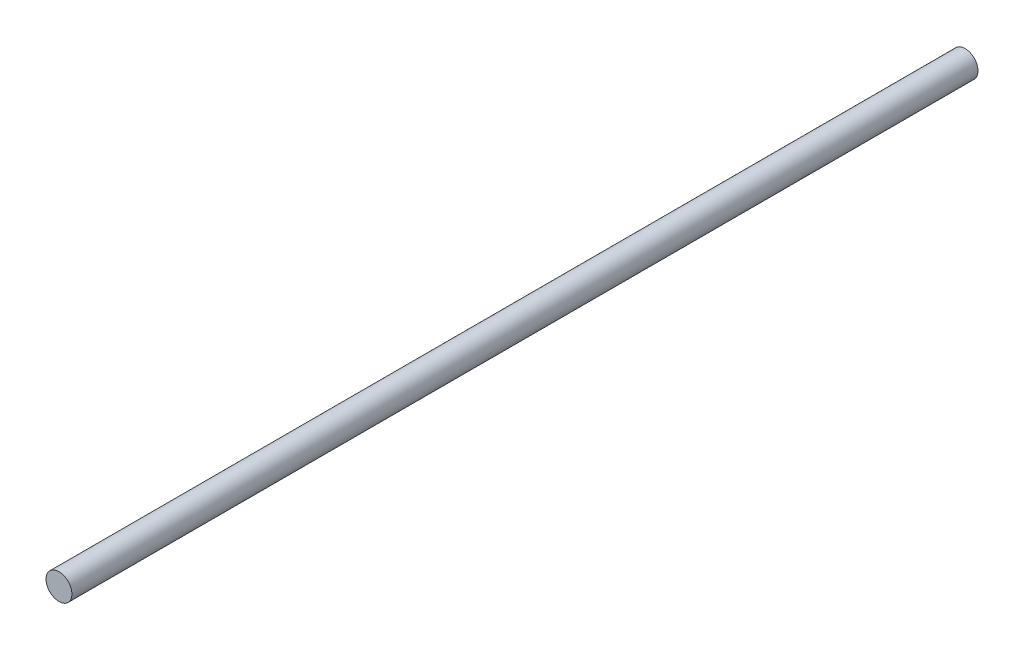
ISO-10303-21;
HEADER;
FILE_DESCRIPTION(('STEP AP214'),'2;1');
FILE_NAME('part.step','',(''),(''),'','','');
FILE_SCHEMA(('AUTOMOTIVE_DESIGN { 1 0 10303 214 1 1 1 1 }'));
ENDSEC;
DATA;
#1=APPLICATION_CONTEXT('core data for automotive mechanical design processes');
#2=APPLICATION_PROTOCOL_DEFINITION('international standard','automotive_design',2000,#1);
#3=PRODUCT_CONTEXT('',#1,'mechanical');
#4=PRODUCT('Part','Part','',(#3));
#5=PRODUCT_RELATED_PRODUCT_CATEGORY('part','',(#4));
#6=PRODUCT_DEFINITION_FORMATION('','',#4);
#7=PRODUCT_DEFINITION_CONTEXT('part definition',#1,'design');
#8=PRODUCT_DEFINITION('design','',#6,#7);
#9=PRODUCT_DEFINITION_SHAPE('','',#8);
#10=(LENGTH_UNIT() NAMED_UNIT(*) SI_UNIT(.MILLI.,.METRE.));
#11=(NAMED_UNIT(*) PLANE_ANGLE_UNIT() SI_UNIT($,.RADIAN.));
#12=(NAMED_UNIT(*) SI_UNIT($,.STERADIAN.) SOLID_ANGLE_UNIT());
#13=UNCERTAINTY_MEASURE_WITH_UNIT(LENGTH_MEASURE(1.E-05),#10,'distance_accuracy_value','');
#14=(GEOMETRIC_REPRESENTATION_CONTEXT(3) GLOBAL_UNCERTAINTY_ASSIGNED_CONTEXT((#13)) GLOBAL_UNIT_ASSIGNED_CONTEXT((#10,
#11,#12)) REPRESENTATION_CONTEXT('',''));
#15=CARTESIAN_POINT('',(0.,0.,0.));
#16=DIRECTION('',(0.,0.,1.));
#17=DIRECTION('',(1.,0.,0.));
#18=AXIS2_PLACEMENT_3D('',#15,#16,#17);
#19=CARTESIAN_POINT('',(-3.01379167716471,0.,-91.2439030318299));
#20=DIRECTION('',(0.,0.,-1.));
#21=DIRECTION('',(-1.,0.,0.));
#22=AXIS2_PLACEMENT_3D('',#19,#20,#21);
#23=CYLINDRICAL_SURFACE('',#22,2.54);
#24=CARTESIAN_POINT('',(-3.0137916771647,0.,86.55609696817));
#25=DIRECTION('',(0.,0.,-1.));
#26=DIRECTION('',(-1.,0.,0.));
#27=AXIS2_PLACEMENT_3D('',#24,#25,#26);
#28=CIRCLE('',#27,2.54);
#29=CARTESIAN_POINT('',(-5.5537916771647,0.,86.55609696817));
#30=VERTEX_POINT('',#29);
#31=EDGE_CURVE('E49',#30,#30,#28,.T.);
#32=ORIENTED_EDGE('',*,*,#31,.T.);
#33=EDGE_LOOP('',(#32));
#34=FACE_BOUND('',#33,.T.);
#35=CARTESIAN_POINT('',(-3.01379167716471,0.,-91.2439030318299));
#36=DIRECTION('',(0.,0.,-1.));
#37=DIRECTION('',(-1.,0.,0.));
#38=AXIS2_PLACEMENT_3D('',#35,#36,#37);
#39=CIRCLE('',#38,2.54);
#40=CARTESIAN_POINT('',(-5.55379167716471,0.,-91.2439030318299));
#41=VERTEX_POINT('',#40);
#42=EDGE_CURVE('E10',#41,#41,#39,.T.);
#43=ORIENTED_EDGE('',*,*,#42,.F.);
#44=EDGE_LOOP('',(#43));
#45=FACE_BOUND('',#44,.T.);
#46=ADVANCED_FACE('F43',(#34,#45),#23,.T.);
#47=CARTESIAN_POINT('',(-5.55379167716471,0.,-91.2439030318299));
#48=DIRECTION('',(0.,0.,1.));
#49=DIRECTION('',(1.,0.,0.));
#50=AXIS2_PLACEMENT_3D('',#47,#48,#49);
#51=PLANE('',#50);
#52=ORIENTED_EDGE('',*,*,#42,.T.);
#53=EDGE_LOOP('',(#52));
#54=FACE_BOUND('',#53,.T.);
#55=ADVANCED_FACE('F59',(#54),#51,.F.);
#56=CARTESIAN_POINT('',(-3.0137916771647,0.,86.55609696817));
#57=DIRECTION('',(0.,0.,-1.));
#58=DIRECTION('',(-1.,0.,0.));
#59=AXIS2_PLACEMENT_3D('',#56,#57,#58);
#60=PLANE('',#59);
#61=ORIENTED_EDGE('',*,*,#31,.F.);
#62=EDGE_LOOP('',(#61));
#63=FACE_BOUND('',#62,.T.);
#64=ADVANCED_FACE('F57',(#63),#60,.F.);
#65=CLOSED_SHELL('',(#46,#55,#64));
#66=MANIFOLD_SOLID_BREP('B2',#65);
#67=ADVANCED_BREP_SHAPE_REPRESENTATION('',(#18,#66),#14);
#68=SHAPE_DEFINITION_REPRESENTATION(#9,#67);
ENDSEC;
END-ISO-10303-21;
